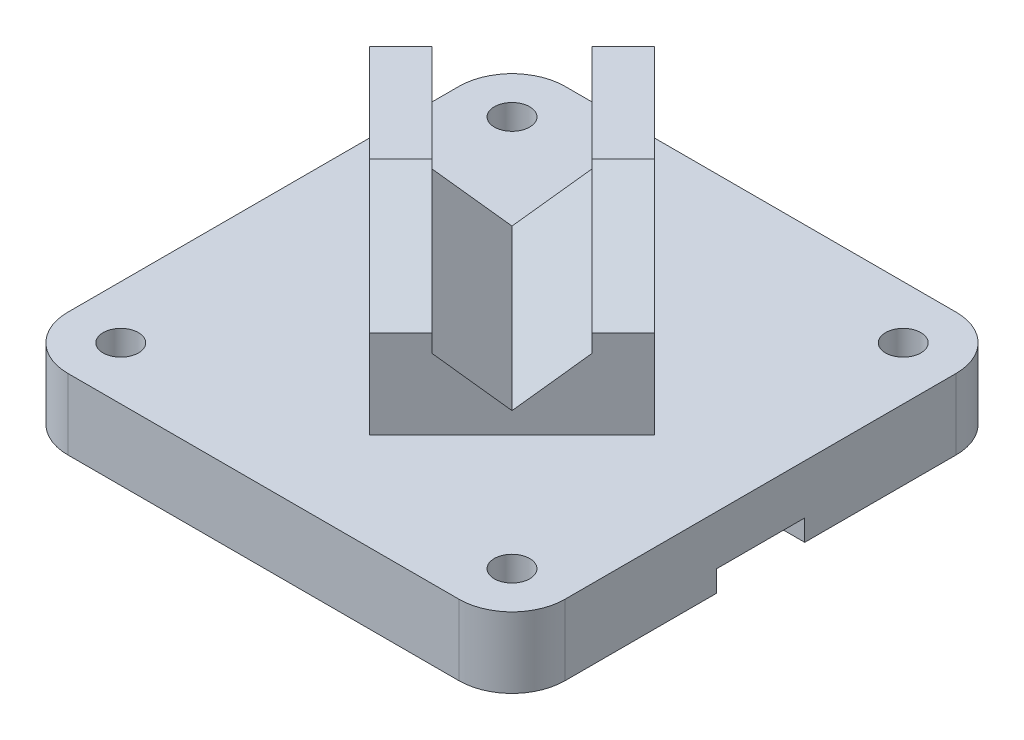
ISO-10303-21;
HEADER;
FILE_DESCRIPTION(('STEP AP214'),'2;1');
FILE_NAME('part.step','',(''),(''),'','','');
FILE_SCHEMA(('AUTOMOTIVE_DESIGN { 1 0 10303 214 1 1 1 1 }'));
ENDSEC;
DATA;
#1=APPLICATION_CONTEXT('core data for automotive mechanical design processes');
#2=APPLICATION_PROTOCOL_DEFINITION('international standard','automotive_design',2000,#1);
#3=PRODUCT_CONTEXT('',#1,'mechanical');
#4=PRODUCT('Part','Part','',(#3));
#5=PRODUCT_RELATED_PRODUCT_CATEGORY('part','',(#4));
#6=PRODUCT_DEFINITION_FORMATION('','',#4);
#7=PRODUCT_DEFINITION_CONTEXT('part definition',#1,'design');
#8=PRODUCT_DEFINITION('design','',#6,#7);
#9=PRODUCT_DEFINITION_SHAPE('','',#8);
#10=(LENGTH_UNIT() NAMED_UNIT(*) SI_UNIT(.MILLI.,.METRE.));
#11=(NAMED_UNIT(*) PLANE_ANGLE_UNIT() SI_UNIT($,.RADIAN.));
#12=(NAMED_UNIT(*) SI_UNIT($,.STERADIAN.) SOLID_ANGLE_UNIT());
#13=UNCERTAINTY_MEASURE_WITH_UNIT(LENGTH_MEASURE(1.E-05),#10,'distance_accuracy_value','');
#14=(GEOMETRIC_REPRESENTATION_CONTEXT(3) GLOBAL_UNCERTAINTY_ASSIGNED_CONTEXT((#13)) GLOBAL_UNIT_ASSIGNED_CONTEXT((#10,
#11,#12)) REPRESENTATION_CONTEXT('',''));
#15=CARTESIAN_POINT('',(0.,0.,0.));
#16=DIRECTION('',(0.,0.,1.));
#17=DIRECTION('',(1.,0.,0.));
#18=AXIS2_PLACEMENT_3D('',#15,#16,#17);
#19=CARTESIAN_POINT('',(0.,0.,0.));
#20=DIRECTION('',(0.,1.,0.));
#21=DIRECTION('',(0.,0.,1.));
#22=AXIS2_PLACEMENT_3D('',#19,#20,#21);
#23=PLANE('',#22);
#24=CARTESIAN_POINT('',(-55.3917579759353,0.,-55.3917579759351));
#25=DIRECTION('',(0.,1.,0.));
#26=DIRECTION('',(0.,0.,1.));
#27=AXIS2_PLACEMENT_3D('',#24,#25,#26);
#28=CIRCLE('',#27,5.00000000000001);
#29=CARTESIAN_POINT('',(-55.3917579759353,0.,-50.391757975935));
#30=VERTEX_POINT('',#29);
#31=EDGE_CURVE('E394',#30,#30,#28,.T.);
#32=ORIENTED_EDGE('',*,*,#31,.T.);
#33=EDGE_LOOP('',(#32));
#34=FACE_BOUND('',#33,.T.);
#35=CARTESIAN_POINT('',(55.3917579759351,0.,-55.3917579759352));
#36=DIRECTION('',(0.,1.,0.));
#37=DIRECTION('',(0.,0.,1.));
#38=AXIS2_PLACEMENT_3D('',#35,#36,#37);
#39=CIRCLE('',#38,4.99999999999999);
#40=CARTESIAN_POINT('',(55.3917579759351,0.,-50.3917579759352));
#41=VERTEX_POINT('',#40);
#42=EDGE_CURVE('E389',#41,#41,#39,.T.);
#43=ORIENTED_EDGE('',*,*,#42,.T.);
#44=EDGE_LOOP('',(#43));
#45=FACE_BOUND('',#44,.T.);
#46=DIRECTION('',(1.,0.,0.));
#47=VECTOR('',#46,1.);
#48=CARTESIAN_POINT('',(-70.3927579759352,0.,-12.5));
#49=LINE('',#48,#47);
#50=CARTESIAN_POINT('',(-70.3917579759351,0.,-12.5));
#51=VERTEX_POINT('',#50);
#52=CARTESIAN_POINT('',(70.3917579759351,0.,-12.5));
#53=VERTEX_POINT('',#52);
#54=EDGE_CURVE('E206',#51,#53,#49,.T.);
#55=ORIENTED_EDGE('',*,*,#54,.F.);
#56=DIRECTION('',(0.,0.,-1.));
#57=VECTOR('',#56,1.);
#58=CARTESIAN_POINT('',(-70.3917579759351,0.,0.));
#59=LINE('',#58,#57);
#60=CARTESIAN_POINT('',(-70.3917579759351,0.,-55.3917579759351));
#61=VERTEX_POINT('',#60);
#62=EDGE_CURVE('E225',#51,#61,#59,.T.);
#63=ORIENTED_EDGE('',*,*,#62,.T.);
#64=CARTESIAN_POINT('',(-55.3917579759353,0.,-55.3917579759351));
#65=DIRECTION('',(0.,1.,0.));
#66=DIRECTION('',(0.,0.,1.));
#67=AXIS2_PLACEMENT_3D('',#64,#65,#66);
#68=CIRCLE('',#67,14.9999999999999);
#69=CARTESIAN_POINT('',(-55.3917579759353,0.,-70.3917579759351));
#70=VERTEX_POINT('',#69);
#71=EDGE_CURVE('E229',#70,#61,#68,.T.);
#72=ORIENTED_EDGE('',*,*,#71,.F.);
#73=DIRECTION('',(1.,0.,0.));
#74=VECTOR('',#73,1.);
#75=CARTESIAN_POINT('',(0.,0.,-70.3917579759351));
#76=LINE('',#75,#74);
#77=CARTESIAN_POINT('',(55.3917579759351,0.,-70.3917579759351));
#78=VERTEX_POINT('',#77);
#79=EDGE_CURVE('E405',#70,#78,#76,.T.);
#80=ORIENTED_EDGE('',*,*,#79,.T.);
#81=CARTESIAN_POINT('',(55.3917579759351,0.,-55.3917579759352));
#82=DIRECTION('',(0.,1.,0.));
#83=DIRECTION('',(0.,0.,1.));
#84=AXIS2_PLACEMENT_3D('',#81,#82,#83);
#85=CIRCLE('',#84,15.);
#86=CARTESIAN_POINT('',(70.3917579759351,0.,-55.3917579759352));
#87=VERTEX_POINT('',#86);
#88=EDGE_CURVE('E399',#87,#78,#85,.T.);
#89=ORIENTED_EDGE('',*,*,#88,.F.);
#90=DIRECTION('',(0.,0.,-1.));
#91=VECTOR('',#90,1.);
#92=CARTESIAN_POINT('',(70.3917579759351,0.,0.));
#93=LINE('',#92,#91);
#94=EDGE_CURVE('E400',#53,#87,#93,.T.);
#95=ORIENTED_EDGE('',*,*,#94,.F.);
#96=EDGE_LOOP('',(#55,#63,#72,#80,#89,#95));
#97=FACE_BOUND('',#96,.T.);
#98=ADVANCED_FACE('F41',(#34,#45,#97),#23,.F.);
#99=CARTESIAN_POINT('',(55.3917579759351,0.,55.3917579759352));
#100=DIRECTION('',(0.,1.,0.));
#101=DIRECTION('',(0.,0.,1.));
#102=AXIS2_PLACEMENT_3D('',#99,#100,#101);
#103=CIRCLE('',#102,4.99999999999999);
#104=CARTESIAN_POINT('',(55.3917579759351,0.,60.3917579759352));
#105=VERTEX_POINT('',#104);
#106=EDGE_CURVE('E235',#105,#105,#103,.F.);
#107=ORIENTED_EDGE('',*,*,#106,.F.);
#108=EDGE_LOOP('',(#107));
#109=FACE_BOUND('',#108,.T.);
#110=CARTESIAN_POINT('',(-55.3917579759353,0.,55.3917579759351));
#111=DIRECTION('',(0.,1.,0.));
#112=DIRECTION('',(0.,0.,1.));
#113=AXIS2_PLACEMENT_3D('',#110,#111,#112);
#114=CIRCLE('',#113,5.00000000000001);
#115=CARTESIAN_POINT('',(-55.3917579759353,0.,60.3917579759351));
#116=VERTEX_POINT('',#115);
#117=EDGE_CURVE('E350',#116,#116,#114,.F.);
#118=ORIENTED_EDGE('',*,*,#117,.F.);
#119=EDGE_LOOP('',(#118));
#120=FACE_BOUND('',#119,.T.);
#121=DIRECTION('',(-1.,0.,0.));
#122=VECTOR('',#121,1.);
#123=CARTESIAN_POINT('',(-70.3927579759352,0.,12.5));
#124=LINE('',#123,#122);
#125=CARTESIAN_POINT('',(70.3917579759351,0.,12.5));
#126=VERTEX_POINT('',#125);
#127=CARTESIAN_POINT('',(-70.3917579759351,0.,12.5));
#128=VERTEX_POINT('',#127);
#129=EDGE_CURVE('E194',#126,#128,#124,.T.);
#130=ORIENTED_EDGE('',*,*,#129,.F.);
#131=CARTESIAN_POINT('',(70.3917579759351,0.,55.3917579759352));
#132=VERTEX_POINT('',#131);
#133=EDGE_CURVE('E397',#132,#126,#93,.T.);
#134=ORIENTED_EDGE('',*,*,#133,.F.);
#135=CARTESIAN_POINT('',(55.3917579759351,0.,55.3917579759352));
#136=DIRECTION('',(0.,1.,0.));
#137=DIRECTION('',(0.,0.,1.));
#138=AXIS2_PLACEMENT_3D('',#135,#136,#137);
#139=CIRCLE('',#138,15.);
#140=CARTESIAN_POINT('',(55.3917579759351,0.,70.3917579759351));
#141=VERTEX_POINT('',#140);
#142=EDGE_CURVE('E393',#132,#141,#139,.F.);
#143=ORIENTED_EDGE('',*,*,#142,.T.);
#144=DIRECTION('',(1.,0.,0.));
#145=VECTOR('',#144,1.);
#146=CARTESIAN_POINT('',(0.,0.,70.3917579759351));
#147=LINE('',#146,#145);
#148=CARTESIAN_POINT('',(-55.3917579759353,0.,70.3917579759351));
#149=VERTEX_POINT('',#148);
#150=EDGE_CURVE('E221',#149,#141,#147,.T.);
#151=ORIENTED_EDGE('',*,*,#150,.F.);
#152=CARTESIAN_POINT('',(-55.3917579759353,0.,55.3917579759351));
#153=DIRECTION('',(0.,1.,0.));
#154=DIRECTION('',(0.,0.,1.));
#155=AXIS2_PLACEMENT_3D('',#152,#153,#154);
#156=CIRCLE('',#155,14.9999999999999);
#157=CARTESIAN_POINT('',(-70.3917579759351,0.,55.3917579759351));
#158=VERTEX_POINT('',#157);
#159=EDGE_CURVE('E222',#149,#158,#156,.F.);
#160=ORIENTED_EDGE('',*,*,#159,.T.);
#161=EDGE_CURVE('E215',#158,#128,#59,.T.);
#162=ORIENTED_EDGE('',*,*,#161,.T.);
#163=EDGE_LOOP('',(#130,#134,#143,#151,#160,#162));
#164=FACE_BOUND('',#163,.T.);
#165=ADVANCED_FACE('F217',(#109,#120,#164),#23,.F.);
#166=CARTESIAN_POINT('',(70.3917579759351,20.,0.));
#167=DIRECTION('',(-1.,0.,0.));
#168=DIRECTION('',(0.,0.,1.));
#169=AXIS2_PLACEMENT_3D('',#166,#167,#168);
#170=PLANE('',#169);
#171=DIRECTION('',(0.,-1.,0.));
#172=VECTOR('',#171,1.);
#173=CARTESIAN_POINT('',(70.3917579759351,-6.,12.5));
#174=LINE('',#173,#172);
#175=CARTESIAN_POINT('',(70.3917579759351,6.,12.5));
#176=VERTEX_POINT('',#175);
#177=EDGE_CURVE('E203',#176,#126,#174,.T.);
#178=ORIENTED_EDGE('',*,*,#177,.F.);
#179=DIRECTION('',(0.,0.,1.));
#180=VECTOR('',#179,1.);
#181=CARTESIAN_POINT('',(70.3917579759351,6.,12.5));
#182=LINE('',#181,#180);
#183=CARTESIAN_POINT('',(70.3917579759351,6.,-12.5));
#184=VERTEX_POINT('',#183);
#185=EDGE_CURVE('E427',#184,#176,#182,.T.);
#186=ORIENTED_EDGE('',*,*,#185,.F.);
#187=DIRECTION('',(0.,1.,0.));
#188=VECTOR('',#187,1.);
#189=CARTESIAN_POINT('',(70.3917579759351,-6.,-12.5));
#190=LINE('',#189,#188);
#191=EDGE_CURVE('E428',#53,#184,#190,.T.);
#192=ORIENTED_EDGE('',*,*,#191,.F.);
#193=ORIENTED_EDGE('',*,*,#94,.T.);
#194=DIRECTION('',(0.,-1.,0.));
#195=VECTOR('',#194,1.);
#196=CARTESIAN_POINT('',(70.3917579759351,20.,-55.3917579759352));
#197=LINE('',#196,#195);
#198=CARTESIAN_POINT('',(70.3917579759351,20.,-55.3917579759352));
#199=VERTEX_POINT('',#198);
#200=EDGE_CURVE('E249',#199,#87,#197,.T.);
#201=ORIENTED_EDGE('',*,*,#200,.F.);
#202=DIRECTION('',(0.,0.,-1.));
#203=VECTOR('',#202,1.);
#204=CARTESIAN_POINT('',(70.3917579759351,20.,0.));
#205=LINE('',#204,#203);
#206=CARTESIAN_POINT('',(70.3917579759351,20.,55.3917579759352));
#207=VERTEX_POINT('',#206);
#208=EDGE_CURVE('E368',#207,#199,#205,.T.);
#209=ORIENTED_EDGE('',*,*,#208,.F.);
#210=DIRECTION('',(0.,-1.,0.));
#211=VECTOR('',#210,1.);
#212=CARTESIAN_POINT('',(70.3917579759351,20.,55.3917579759352));
#213=LINE('',#212,#211);
#214=EDGE_CURVE('E251',#207,#132,#213,.T.);
#215=ORIENTED_EDGE('',*,*,#214,.T.);
#216=ORIENTED_EDGE('',*,*,#133,.T.);
#217=EDGE_LOOP('',(#178,#186,#192,#193,#201,#209,#215,#216));
#218=FACE_BOUND('',#217,.T.);
#219=ADVANCED_FACE('F424',(#218),#170,.F.);
#220=CARTESIAN_POINT('',(-70.3917579759351,20.,0.));
#221=DIRECTION('',(-1.,0.,0.));
#222=DIRECTION('',(0.,0.,1.));
#223=AXIS2_PLACEMENT_3D('',#220,#221,#222);
#224=PLANE('',#223);
#225=ORIENTED_EDGE('',*,*,#62,.F.);
#226=DIRECTION('',(0.,1.,0.));
#227=VECTOR('',#226,1.);
#228=CARTESIAN_POINT('',(-70.3917579759351,-6.,-12.5));
#229=LINE('',#228,#227);
#230=CARTESIAN_POINT('',(-70.3917579759351,6.,-12.5));
#231=VERTEX_POINT('',#230);
#232=EDGE_CURVE('E216',#51,#231,#229,.T.);
#233=ORIENTED_EDGE('',*,*,#232,.T.);
#234=DIRECTION('',(0.,0.,1.));
#235=VECTOR('',#234,1.);
#236=CARTESIAN_POINT('',(-70.3917579759351,6.,12.5));
#237=LINE('',#236,#235);
#238=CARTESIAN_POINT('',(-70.3917579759351,6.,12.5));
#239=VERTEX_POINT('',#238);
#240=EDGE_CURVE('E214',#231,#239,#237,.T.);
#241=ORIENTED_EDGE('',*,*,#240,.T.);
#242=DIRECTION('',(0.,-1.,0.));
#243=VECTOR('',#242,1.);
#244=CARTESIAN_POINT('',(-70.3917579759351,-6.,12.5));
#245=LINE('',#244,#243);
#246=EDGE_CURVE('E196',#239,#128,#245,.T.);
#247=ORIENTED_EDGE('',*,*,#246,.T.);
#248=ORIENTED_EDGE('',*,*,#161,.F.);
#249=DIRECTION('',(0.,-1.,0.));
#250=VECTOR('',#249,1.);
#251=CARTESIAN_POINT('',(-70.3917579759351,20.,55.3917579759351));
#252=LINE('',#251,#250);
#253=CARTESIAN_POINT('',(-70.3917579759351,20.,55.3917579759351));
#254=VERTEX_POINT('',#253);
#255=EDGE_CURVE('E244',#254,#158,#252,.T.);
#256=ORIENTED_EDGE('',*,*,#255,.F.);
#257=DIRECTION('',(0.,0.,-1.));
#258=VECTOR('',#257,1.);
#259=CARTESIAN_POINT('',(-70.3917579759351,20.,0.));
#260=LINE('',#259,#258);
#261=CARTESIAN_POINT('',(-70.3917579759351,20.,-55.3917579759351));
#262=VERTEX_POINT('',#261);
#263=EDGE_CURVE('E376',#254,#262,#260,.T.);
#264=ORIENTED_EDGE('',*,*,#263,.T.);
#265=DIRECTION('',(0.,-1.,0.));
#266=VECTOR('',#265,1.);
#267=CARTESIAN_POINT('',(-70.3917579759351,20.,-55.3917579759351));
#268=LINE('',#267,#266);
#269=EDGE_CURVE('E245',#262,#61,#268,.T.);
#270=ORIENTED_EDGE('',*,*,#269,.T.);
#271=EDGE_LOOP('',(#225,#233,#241,#247,#248,#256,#264,#270));
#272=FACE_BOUND('',#271,.T.);
#273=ADVANCED_FACE('F211',(#272),#224,.T.);
#274=CARTESIAN_POINT('',(0.,70.,0.));
#275=DIRECTION('',(0.,1.,0.));
#276=DIRECTION('',(0.,0.,1.));
#277=AXIS2_PLACEMENT_3D('',#274,#275,#276);
#278=PLANE('',#277);
#279=DIRECTION('',(0.707106781186548,0.,0.707106781186547));
#280=VECTOR('',#279,1.);
#281=CARTESIAN_POINT('',(-59.0780494769504,70.,-81.7054664749199));
#282=LINE('',#281,#280);
#283=CARTESIAN_POINT('',(-11.3137084989848,70.,-33.9411254969543));
#284=VERTEX_POINT('',#283);
#285=CARTESIAN_POINT('',(16.2634559672906,70.,-6.36396103067892));
#286=VERTEX_POINT('',#285);
#287=EDGE_CURVE('E309',#284,#286,#282,.T.);
#288=ORIENTED_EDGE('',*,*,#287,.T.);
#289=DIRECTION('',(0.707106781186548,0.,-0.707106781186548));
#290=VECTOR('',#289,1.);
#291=CARTESIAN_POINT('',(25.1022907321225,70.,-15.2027957955107));
#292=LINE('',#291,#290);
#293=CARTESIAN_POINT('',(25.1022907321225,70.,-15.2027957955107));
#294=VERTEX_POINT('',#293);
#295=EDGE_CURVE('E282',#286,#294,#292,.T.);
#296=ORIENTED_EDGE('',*,*,#295,.T.);
#297=DIRECTION('',(-0.707106781186548,0.,-0.707106781186548));
#298=VECTOR('',#297,1.);
#299=CARTESIAN_POINT('',(20.1525432638166,70.,-20.1525432638166));
#300=LINE('',#299,#298);
#301=CARTESIAN_POINT('',(-2.47487373415294,70.,-42.7799602617861));
#302=VERTEX_POINT('',#301);
#303=EDGE_CURVE('E294',#294,#302,#300,.T.);
#304=ORIENTED_EDGE('',*,*,#303,.T.);
#305=DIRECTION('',(0.707106781186547,0.,-0.707106781186548));
#306=VECTOR('',#305,1.);
#307=CARTESIAN_POINT('',(-22.6274169979695,70.,-22.6274169979695));
#308=LINE('',#307,#306);
#309=EDGE_CURVE('E318',#284,#302,#308,.T.);
#310=ORIENTED_EDGE('',*,*,#309,.F.);
#311=EDGE_LOOP('',(#288,#296,#304,#310));
#312=FACE_BOUND('',#311,.T.);
#313=ADVANCED_FACE('F316',(#312),#278,.T.);
#314=CARTESIAN_POINT('',(-22.6274169979695,70.,-22.6274169979695));
#315=DIRECTION('',(-0.707106781186548,0.,-0.707106781186547));
#316=DIRECTION('',(-0.707106781186547,0.,0.707106781186548));
#317=AXIS2_PLACEMENT_3D('',#314,#315,#316);
#318=PLANE('',#317);
#319=CARTESIAN_POINT('',(-42.7799602617861,70.,-2.47487373415289));
#320=VERTEX_POINT('',#319);
#321=CARTESIAN_POINT('',(-33.9411254969543,70.,-11.3137084989847));
#322=VERTEX_POINT('',#321);
#323=EDGE_CURVE('E333',#320,#322,#308,.T.);
#324=ORIENTED_EDGE('',*,*,#323,.T.);
#325=DIRECTION('',(0.,-1.,0.));
#326=VECTOR('',#325,1.);
#327=CARTESIAN_POINT('',(-33.9411254969543,70.,-11.3137084989847));
#328=LINE('',#327,#326);
#329=CARTESIAN_POINT('',(-33.9411254969543,40.,-11.3137084989848));
#330=VERTEX_POINT('',#329);
#331=EDGE_CURVE('E257',#322,#330,#328,.T.);
#332=ORIENTED_EDGE('',*,*,#331,.T.);
#333=DIRECTION('',(0.532152084190191,-0.658504607868518,-0.532152084190192));
#334=VECTOR('',#333,1.);
#335=CARTESIAN_POINT('',(-38.0460993771169,45.0796460176991,-7.20873461882211));
#336=LINE('',#335,#334);
#337=CARTESIAN_POINT('',(-22.6274169979695,26.,-22.6274169979695));
#338=VERTEX_POINT('',#337);
#339=EDGE_CURVE('E254',#330,#338,#336,.T.);
#340=ORIENTED_EDGE('',*,*,#339,.T.);
#341=DIRECTION('',(0.532152084190191,0.658504607868518,-0.532152084190192));
#342=VECTOR('',#341,1.);
#343=CARTESIAN_POINT('',(-7.20873461882218,45.0796460176991,-38.0460993771169));
#344=LINE('',#343,#342);
#345=CARTESIAN_POINT('',(-11.3137084989848,40.,-33.9411254969543));
#346=VERTEX_POINT('',#345);
#347=EDGE_CURVE('E271',#338,#346,#344,.T.);
#348=ORIENTED_EDGE('',*,*,#347,.T.);
#349=DIRECTION('',(0.,1.,0.));
#350=VECTOR('',#349,1.);
#351=CARTESIAN_POINT('',(-11.3137084989848,70.,-33.9411254969543));
#352=LINE('',#351,#350);
#353=EDGE_CURVE('E262',#346,#284,#352,.T.);
#354=ORIENTED_EDGE('',*,*,#353,.T.);
#355=ORIENTED_EDGE('',*,*,#309,.T.);
#356=DIRECTION('',(0.,-1.,0.));
#357=VECTOR('',#356,1.);
#358=CARTESIAN_POINT('',(-2.47487373415294,70.,-42.7799602617861));
#359=LINE('',#358,#357);
#360=CARTESIAN_POINT('',(-2.47487373415294,20.,-42.7799602617861));
#361=VERTEX_POINT('',#360);
#362=EDGE_CURVE('E302',#302,#361,#359,.T.);
#363=ORIENTED_EDGE('',*,*,#362,.T.);
#364=DIRECTION('',(0.707106781186547,0.,-0.707106781186548));
#365=VECTOR('',#364,1.);
#366=CARTESIAN_POINT('',(-22.6274169979695,20.,-22.6274169979695));
#367=LINE('',#366,#365);
#368=CARTESIAN_POINT('',(-42.7799602617861,20.,-2.47487373415289));
#369=VERTEX_POINT('',#368);
#370=EDGE_CURVE('E352',#369,#361,#367,.T.);
#371=ORIENTED_EDGE('',*,*,#370,.F.);
#372=DIRECTION('',(0.,-1.,0.));
#373=VECTOR('',#372,1.);
#374=CARTESIAN_POINT('',(-42.7799602617861,70.,-2.47487373415289));
#375=LINE('',#374,#373);
#376=EDGE_CURVE('E343',#320,#369,#375,.T.);
#377=ORIENTED_EDGE('',*,*,#376,.F.);
#378=EDGE_LOOP('',(#324,#332,#340,#348,#354,#355,#363,#371,#377));
#379=FACE_BOUND('',#378,.T.);
#380=ADVANCED_FACE('F474',(#379),#318,.T.);
#381=CARTESIAN_POINT('',(-70.3917579759352,52.,70.3917579759352));
#382=DIRECTION('',(0.707106781186548,0.,-0.707106781186547));
#383=DIRECTION('',(-0.707106781186547,0.,-0.707106781186548));
#384=AXIS2_PLACEMENT_3D('',#381,#382,#383);
#385=CYLINDRICAL_SURFACE('',#384,8.00000000000001);
#386=CARTESIAN_POINT('',(-20.1525432638166,52.,20.1525432638166));
#387=DIRECTION('',(-0.707106781186548,0.,0.707106781186548));
#388=DIRECTION('',(0.707106781186548,0.,0.707106781186548));
#389=AXIS2_PLACEMENT_3D('',#386,#387,#388);
#390=CIRCLE('',#389,8.00000000000001);
#391=CARTESIAN_POINT('',(-14.4956890143242,52.,25.809397513309));
#392=VERTEX_POINT('',#391);
#393=EDGE_CURVE('E258',#392,#392,#390,.T.);
#394=ORIENTED_EDGE('',*,*,#393,.T.);
#395=EDGE_LOOP('',(#394));
#396=FACE_BOUND('',#395,.T.);
#397=CARTESIAN_POINT('',(-11.3137084989848,52.,11.3137084989848));
#398=DIRECTION('',(0.707106781186547,0.,-0.707106781186548));
#399=DIRECTION('',(-0.707106781186548,0.,-0.707106781186547));
#400=AXIS2_PLACEMENT_3D('',#397,#398,#399);
#401=CIRCLE('',#400,8.00000000000001);
#402=CARTESIAN_POINT('',(-16.9705627484771,52.,5.65685424949239));
#403=VERTEX_POINT('',#402);
#404=EDGE_CURVE('E266',#403,#403,#401,.F.);
#405=ORIENTED_EDGE('',*,*,#404,.F.);
#406=EDGE_LOOP('',(#405));
#407=FACE_BOUND('',#406,.T.);
#408=ADVANCED_FACE('F486',(#396,#407),#385,.F.);
#409=CARTESIAN_POINT('',(20.1525432638166,52.,-20.1525432638166));
#410=DIRECTION('',(-0.707106781186548,0.,0.707106781186548));
#411=DIRECTION('',(0.707106781186548,0.,0.707106781186548));
#412=AXIS2_PLACEMENT_3D('',#409,#410,#411);
#413=CIRCLE('',#412,8.00000000000001);
#414=CARTESIAN_POINT('',(25.809397513309,52.,-14.4956890143242));
#415=VERTEX_POINT('',#414);
#416=EDGE_CURVE('E259',#415,#415,#413,.T.);
#417=ORIENTED_EDGE('',*,*,#416,.F.);
#418=EDGE_LOOP('',(#417));
#419=FACE_BOUND('',#418,.T.);
#420=CARTESIAN_POINT('',(11.3137084989848,52.,-11.3137084989847));
#421=DIRECTION('',(-0.707106781186547,0.,0.707106781186548));
#422=DIRECTION('',(0.707106781186548,0.,0.707106781186547));
#423=AXIS2_PLACEMENT_3D('',#420,#421,#422);
#424=CIRCLE('',#423,8.00000000000001);
#425=CARTESIAN_POINT('',(16.9705627484772,52.,-5.65685424949236));
#426=VERTEX_POINT('',#425);
#427=EDGE_CURVE('E261',#426,#426,#424,.F.);
#428=ORIENTED_EDGE('',*,*,#427,.F.);
#429=EDGE_LOOP('',(#428));
#430=FACE_BOUND('',#429,.T.);
#431=ADVANCED_FACE('F488',(#419,#430),#385,.F.);
#432=CARTESIAN_POINT('',(55.3917579759351,20.,55.3917579759352));
#433=DIRECTION('',(0.,-1.,0.));
#434=DIRECTION('',(0.,0.,-1.));
#435=AXIS2_PLACEMENT_3D('',#432,#433,#434);
#436=CYLINDRICAL_SURFACE('',#435,15.);
#437=ORIENTED_EDGE('',*,*,#142,.F.);
#438=ORIENTED_EDGE('',*,*,#214,.F.);
#439=CARTESIAN_POINT('',(55.3917579759351,20.,55.3917579759352));
#440=DIRECTION('',(0.,1.,0.));
#441=DIRECTION('',(0.,0.,1.));
#442=AXIS2_PLACEMENT_3D('',#439,#440,#441);
#443=CIRCLE('',#442,15.);
#444=CARTESIAN_POINT('',(55.3917579759351,20.,70.3917579759351));
#445=VERTEX_POINT('',#444);
#446=EDGE_CURVE('E361',#207,#445,#443,.F.);
#447=ORIENTED_EDGE('',*,*,#446,.T.);
#448=DIRECTION('',(0.,-1.,0.));
#449=VECTOR('',#448,1.);
#450=CARTESIAN_POINT('',(55.3917579759351,20.,70.3917579759351));
#451=LINE('',#450,#449);
#452=EDGE_CURVE('E237',#445,#141,#451,.T.);
#453=ORIENTED_EDGE('',*,*,#452,.T.);
#454=EDGE_LOOP('',(#437,#438,#447,#453));
#455=FACE_BOUND('',#454,.T.);
#456=ADVANCED_FACE('F494',(#455),#436,.T.);
#457=CARTESIAN_POINT('',(55.3917579759351,20.,-55.3917579759352));
#458=DIRECTION('',(0.,-1.,0.));
#459=DIRECTION('',(0.,0.,-1.));
#460=AXIS2_PLACEMENT_3D('',#457,#458,#459);
#461=CYLINDRICAL_SURFACE('',#460,15.);
#462=ORIENTED_EDGE('',*,*,#88,.T.);
#463=DIRECTION('',(0.,-1.,0.));
#464=VECTOR('',#463,1.);
#465=CARTESIAN_POINT('',(55.3917579759351,20.,-70.3917579759351));
#466=LINE('',#465,#464);
#467=CARTESIAN_POINT('',(55.3917579759351,20.,-70.3917579759351));
#468=VERTEX_POINT('',#467);
#469=EDGE_CURVE('E247',#468,#78,#466,.T.);
#470=ORIENTED_EDGE('',*,*,#469,.F.);
#471=CARTESIAN_POINT('',(55.3917579759351,20.,-55.3917579759352));
#472=DIRECTION('',(0.,1.,0.));
#473=DIRECTION('',(0.,0.,1.));
#474=AXIS2_PLACEMENT_3D('',#471,#472,#473);
#475=CIRCLE('',#474,15.);
#476=EDGE_CURVE('E369',#199,#468,#475,.T.);
#477=ORIENTED_EDGE('',*,*,#476,.F.);
#478=ORIENTED_EDGE('',*,*,#200,.T.);
#479=EDGE_LOOP('',(#462,#470,#477,#478));
#480=FACE_BOUND('',#479,.T.);
#481=ADVANCED_FACE('F420',(#480),#461,.T.);
#482=CARTESIAN_POINT('',(0.,20.,-70.3917579759351));
#483=DIRECTION('',(0.,0.,-1.));
#484=DIRECTION('',(-1.,0.,0.));
#485=AXIS2_PLACEMENT_3D('',#482,#483,#484);
#486=PLANE('',#485);
#487=ORIENTED_EDGE('',*,*,#79,.F.);
#488=DIRECTION('',(0.,-1.,0.));
#489=VECTOR('',#488,1.);
#490=CARTESIAN_POINT('',(-55.3917579759353,20.,-70.3917579759351));
#491=LINE('',#490,#489);
#492=CARTESIAN_POINT('',(-55.3917579759353,20.,-70.3917579759351));
#493=VERTEX_POINT('',#492);
#494=EDGE_CURVE('E246',#493,#70,#491,.T.);
#495=ORIENTED_EDGE('',*,*,#494,.F.);
#496=DIRECTION('',(1.,0.,0.));
#497=VECTOR('',#496,1.);
#498=CARTESIAN_POINT('',(0.,20.,-70.3917579759351));
#499=LINE('',#498,#497);
#500=EDGE_CURVE('E371',#493,#468,#499,.T.);
#501=ORIENTED_EDGE('',*,*,#500,.T.);
#502=ORIENTED_EDGE('',*,*,#469,.T.);
#503=EDGE_LOOP('',(#487,#495,#501,#502));
#504=FACE_BOUND('',#503,.T.);
#505=ADVANCED_FACE('F414',(#504),#486,.T.);
#506=CARTESIAN_POINT('',(-55.3917579759353,20.,-55.3917579759351));
#507=DIRECTION('',(0.,-1.,0.));
#508=DIRECTION('',(0.,0.,-1.));
#509=AXIS2_PLACEMENT_3D('',#506,#507,#508);
#510=CYLINDRICAL_SURFACE('',#509,14.9999999999999);
#511=ORIENTED_EDGE('',*,*,#71,.T.);
#512=ORIENTED_EDGE('',*,*,#269,.F.);
#513=CARTESIAN_POINT('',(-55.3917579759353,20.,-55.3917579759351));
#514=DIRECTION('',(0.,1.,0.));
#515=DIRECTION('',(0.,0.,1.));
#516=AXIS2_PLACEMENT_3D('',#513,#514,#515);
#517=CIRCLE('',#516,14.9999999999999);
#518=EDGE_CURVE('E372',#493,#262,#517,.T.);
#519=ORIENTED_EDGE('',*,*,#518,.F.);
#520=ORIENTED_EDGE('',*,*,#494,.T.);
#521=EDGE_LOOP('',(#511,#512,#519,#520));
#522=FACE_BOUND('',#521,.T.);
#523=ADVANCED_FACE('F411',(#522),#510,.T.);
#524=CARTESIAN_POINT('',(-55.3917579759353,20.,55.3917579759351));
#525=DIRECTION('',(0.,-1.,0.));
#526=DIRECTION('',(0.,0.,-1.));
#527=AXIS2_PLACEMENT_3D('',#524,#525,#526);
#528=CYLINDRICAL_SURFACE('',#527,14.9999999999999);
#529=ORIENTED_EDGE('',*,*,#159,.F.);
#530=DIRECTION('',(0.,-1.,0.));
#531=VECTOR('',#530,1.);
#532=CARTESIAN_POINT('',(-55.3917579759353,20.,70.3917579759351));
#533=LINE('',#532,#531);
#534=CARTESIAN_POINT('',(-55.3917579759353,20.,70.3917579759351));
#535=VERTEX_POINT('',#534);
#536=EDGE_CURVE('E236',#535,#149,#533,.T.);
#537=ORIENTED_EDGE('',*,*,#536,.F.);
#538=CARTESIAN_POINT('',(-55.3917579759353,20.,55.3917579759351));
#539=DIRECTION('',(0.,1.,0.));
#540=DIRECTION('',(0.,0.,1.));
#541=AXIS2_PLACEMENT_3D('',#538,#539,#540);
#542=CIRCLE('',#541,14.9999999999999);
#543=EDGE_CURVE('E377',#535,#254,#542,.F.);
#544=ORIENTED_EDGE('',*,*,#543,.T.);
#545=ORIENTED_EDGE('',*,*,#255,.T.);
#546=EDGE_LOOP('',(#529,#537,#544,#545));
#547=FACE_BOUND('',#546,.T.);
#548=ADVANCED_FACE('F518',(#547),#528,.T.);
#549=CARTESIAN_POINT('',(0.,20.,70.3917579759351));
#550=DIRECTION('',(0.,0.,-1.));
#551=DIRECTION('',(-1.,0.,0.));
#552=AXIS2_PLACEMENT_3D('',#549,#550,#551);
#553=PLANE('',#552);
#554=ORIENTED_EDGE('',*,*,#150,.T.);
#555=ORIENTED_EDGE('',*,*,#452,.F.);
#556=DIRECTION('',(1.,0.,0.));
#557=VECTOR('',#556,1.);
#558=CARTESIAN_POINT('',(0.,20.,70.3917579759351));
#559=LINE('',#558,#557);
#560=EDGE_CURVE('E385',#535,#445,#559,.T.);
#561=ORIENTED_EDGE('',*,*,#560,.F.);
#562=ORIENTED_EDGE('',*,*,#536,.T.);
#563=EDGE_LOOP('',(#554,#555,#561,#562));
#564=FACE_BOUND('',#563,.T.);
#565=ADVANCED_FACE('F513',(#564),#553,.F.);
#566=CARTESIAN_POINT('',(-55.3917579759353,20.,-55.3917579759351));
#567=DIRECTION('',(0.,-1.,0.));
#568=DIRECTION('',(0.,0.,-1.));
#569=AXIS2_PLACEMENT_3D('',#566,#567,#568);
#570=CYLINDRICAL_SURFACE('',#569,5.00000000000001);
#571=CARTESIAN_POINT('',(-55.3917579759353,20.,-55.3917579759351));
#572=DIRECTION('',(0.,1.,0.));
#573=DIRECTION('',(0.,0.,1.));
#574=AXIS2_PLACEMENT_3D('',#571,#572,#573);
#575=CIRCLE('',#574,5.00000000000001);
#576=CARTESIAN_POINT('',(-55.3917579759353,20.,-50.391757975935));
#577=VERTEX_POINT('',#576);
#578=EDGE_CURVE('E359',#577,#577,#575,.T.);
#579=ORIENTED_EDGE('',*,*,#578,.T.);
#580=EDGE_LOOP('',(#579));
#581=FACE_BOUND('',#580,.T.);
#582=ORIENTED_EDGE('',*,*,#31,.F.);
#583=EDGE_LOOP('',(#582));
#584=FACE_BOUND('',#583,.T.);
#585=ADVANCED_FACE('F520',(#581,#584),#570,.F.);
#586=CARTESIAN_POINT('',(55.3917579759351,20.,-55.3917579759352));
#587=DIRECTION('',(0.,-1.,0.));
#588=DIRECTION('',(0.,0.,-1.));
#589=AXIS2_PLACEMENT_3D('',#586,#587,#588);
#590=CYLINDRICAL_SURFACE('',#589,4.99999999999999);
#591=CARTESIAN_POINT('',(55.3917579759351,20.,-55.3917579759352));
#592=DIRECTION('',(0.,1.,0.));
#593=DIRECTION('',(0.,0.,1.));
#594=AXIS2_PLACEMENT_3D('',#591,#592,#593);
#595=CIRCLE('',#594,4.99999999999999);
#596=CARTESIAN_POINT('',(55.3917579759351,20.,-50.3917579759352));
#597=VERTEX_POINT('',#596);
#598=EDGE_CURVE('E348',#597,#597,#595,.T.);
#599=ORIENTED_EDGE('',*,*,#598,.T.);
#600=EDGE_LOOP('',(#599));
#601=FACE_BOUND('',#600,.T.);
#602=ORIENTED_EDGE('',*,*,#42,.F.);
#603=EDGE_LOOP('',(#602));
#604=FACE_BOUND('',#603,.T.);
#605=ADVANCED_FACE('F537',(#601,#604),#590,.F.);
#606=CARTESIAN_POINT('',(-55.3917579759353,20.,55.3917579759351));
#607=DIRECTION('',(0.,-1.,0.));
#608=DIRECTION('',(0.,0.,-1.));
#609=AXIS2_PLACEMENT_3D('',#606,#607,#608);
#610=CYLINDRICAL_SURFACE('',#609,5.00000000000001);
#611=CARTESIAN_POINT('',(-55.3917579759353,20.,55.3917579759351));
#612=DIRECTION('',(0.,1.,0.));
#613=DIRECTION('',(0.,0.,1.));
#614=AXIS2_PLACEMENT_3D('',#611,#612,#613);
#615=CIRCLE('',#614,5.00000000000001);
#616=CARTESIAN_POINT('',(-55.3917579759353,20.,60.3917579759351));
#617=VERTEX_POINT('',#616);
#618=EDGE_CURVE('E234',#617,#617,#615,.F.);
#619=ORIENTED_EDGE('',*,*,#618,.F.);
#620=EDGE_LOOP('',(#619));
#621=FACE_BOUND('',#620,.T.);
#622=ORIENTED_EDGE('',*,*,#117,.T.);
#623=EDGE_LOOP('',(#622));
#624=FACE_BOUND('',#623,.T.);
#625=ADVANCED_FACE('F511',(#621,#624),#610,.F.);
#626=CARTESIAN_POINT('',(55.3917579759351,20.,55.3917579759352));
#627=DIRECTION('',(0.,-1.,0.));
#628=DIRECTION('',(0.,0.,-1.));
#629=AXIS2_PLACEMENT_3D('',#626,#627,#628);
#630=CYLINDRICAL_SURFACE('',#629,4.99999999999999);
#631=CARTESIAN_POINT('',(55.3917579759351,20.,55.3917579759352));
#632=DIRECTION('',(0.,1.,0.));
#633=DIRECTION('',(0.,0.,1.));
#634=AXIS2_PLACEMENT_3D('',#631,#632,#633);
#635=CIRCLE('',#634,4.99999999999999);
#636=CARTESIAN_POINT('',(55.3917579759351,20.,60.3917579759352));
#637=VERTEX_POINT('',#636);
#638=EDGE_CURVE('E239',#637,#637,#635,.F.);
#639=ORIENTED_EDGE('',*,*,#638,.F.);
#640=EDGE_LOOP('',(#639));
#641=FACE_BOUND('',#640,.T.);
#642=ORIENTED_EDGE('',*,*,#106,.T.);
#643=EDGE_LOOP('',(#642));
#644=FACE_BOUND('',#643,.T.);
#645=ADVANCED_FACE('F509',(#641,#644),#630,.F.);
#646=CARTESIAN_POINT('',(0.,20.,0.));
#647=DIRECTION('',(0.,1.,0.));
#648=DIRECTION('',(0.,0.,1.));
#649=AXIS2_PLACEMENT_3D('',#646,#647,#648);
#650=PLANE('',#649);
#651=ORIENTED_EDGE('',*,*,#618,.T.);
#652=EDGE_LOOP('',(#651));
#653=FACE_BOUND('',#652,.T.);
#654=ORIENTED_EDGE('',*,*,#598,.F.);
#655=EDGE_LOOP('',(#654));
#656=FACE_BOUND('',#655,.T.);
#657=DIRECTION('',(-0.707106781186548,0.,-0.707106781186548));
#658=VECTOR('',#657,1.);
#659=CARTESIAN_POINT('',(-20.1525432638166,20.,20.1525432638166));
#660=LINE('',#659,#658);
#661=CARTESIAN_POINT('',(2.47487373415294,20.,42.7799602617861));
#662=VERTEX_POINT('',#661);
#663=EDGE_CURVE('E355',#662,#369,#660,.T.);
#664=ORIENTED_EDGE('',*,*,#663,.T.);
#665=ORIENTED_EDGE('',*,*,#370,.T.);
#666=DIRECTION('',(-0.707106781186548,0.,-0.707106781186548));
#667=VECTOR('',#666,1.);
#668=CARTESIAN_POINT('',(20.1525432638166,20.,-20.1525432638166));
#669=LINE('',#668,#667);
#670=CARTESIAN_POINT('',(42.7799602617861,20.,2.47487373415294));
#671=VERTEX_POINT('',#670);
#672=EDGE_CURVE('E360',#671,#361,#669,.T.);
#673=ORIENTED_EDGE('',*,*,#672,.F.);
#674=DIRECTION('',(0.707106781186548,0.,-0.707106781186548));
#675=VECTOR('',#674,1.);
#676=CARTESIAN_POINT('',(22.6274169979695,20.,22.6274169979695));
#677=LINE('',#676,#675);
#678=EDGE_CURVE('E301',#662,#671,#677,.T.);
#679=ORIENTED_EDGE('',*,*,#678,.F.);
#680=EDGE_LOOP('',(#664,#665,#673,#679));
#681=FACE_BOUND('',#680,.T.);
#682=ORIENTED_EDGE('',*,*,#578,.F.);
#683=EDGE_LOOP('',(#682));
#684=FACE_BOUND('',#683,.T.);
#685=ORIENTED_EDGE('',*,*,#446,.F.);
#686=ORIENTED_EDGE('',*,*,#208,.T.);
#687=ORIENTED_EDGE('',*,*,#476,.T.);
#688=ORIENTED_EDGE('',*,*,#500,.F.);
#689=ORIENTED_EDGE('',*,*,#518,.T.);
#690=ORIENTED_EDGE('',*,*,#263,.F.);
#691=ORIENTED_EDGE('',*,*,#543,.F.);
#692=ORIENTED_EDGE('',*,*,#560,.T.);
#693=EDGE_LOOP('',(#685,#686,#687,#688,#689,#690,#691,#692));
#694=FACE_BOUND('',#693,.T.);
#695=ORIENTED_EDGE('',*,*,#638,.T.);
#696=EDGE_LOOP('',(#695));
#697=FACE_BOUND('',#696,.T.);
#698=ADVANCED_FACE('F476',(#653,#656,#681,#684,#694,#697),#650,.T.);
#699=DIRECTION('',(-0.707106781186548,0.,-0.707106781186548));
#700=VECTOR('',#699,1.);
#701=CARTESIAN_POINT('',(-20.1525432638166,70.,20.1525432638166));
#702=LINE('',#701,#700);
#703=CARTESIAN_POINT('',(-15.2027957955108,70.,25.1022907321224));
#704=VERTEX_POINT('',#703);
#705=EDGE_CURVE('E340',#704,#320,#702,.T.);
#706=ORIENTED_EDGE('',*,*,#705,.F.);
#707=DIRECTION('',(0.707106781186548,0.,-0.707106781186548));
#708=VECTOR('',#707,1.);
#709=CARTESIAN_POINT('',(-6.36396103067892,70.,16.2634559672906));
#710=LINE('',#709,#708);
#711=CARTESIAN_POINT('',(-6.36396103067893,70.,16.2634559672906));
#712=VERTEX_POINT('',#711);
#713=EDGE_CURVE('E273',#704,#712,#710,.T.);
#714=ORIENTED_EDGE('',*,*,#713,.T.);
#715=DIRECTION('',(0.707106781186548,0.,0.707106781186547));
#716=VECTOR('',#715,1.);
#717=CARTESIAN_POINT('',(-81.70546647492,70.,-59.0780494769504));
#718=LINE('',#717,#716);
#719=EDGE_CURVE('E264',#322,#712,#718,.T.);
#720=ORIENTED_EDGE('',*,*,#719,.F.);
#721=ORIENTED_EDGE('',*,*,#323,.F.);
#722=EDGE_LOOP('',(#706,#714,#720,#721));
#723=FACE_BOUND('',#722,.T.);
#724=ADVANCED_FACE('F472',(#723),#278,.T.);
#725=CARTESIAN_POINT('',(20.1525432638166,70.,-20.1525432638166));
#726=DIRECTION('',(-0.707106781186548,0.,0.707106781186548));
#727=DIRECTION('',(0.707106781186548,0.,0.707106781186548));
#728=AXIS2_PLACEMENT_3D('',#725,#726,#727);
#729=PLANE('',#728);
#730=ORIENTED_EDGE('',*,*,#416,.T.);
#731=EDGE_LOOP('',(#730));
#732=FACE_BOUND('',#731,.T.);
#733=ORIENTED_EDGE('',*,*,#303,.F.);
#734=DIRECTION('',(0.499999999999999,-0.707106781186549,0.499999999999999));
#735=VECTOR('',#734,1.);
#736=CARTESIAN_POINT('',(25.1022907321225,70.,-15.2027957955107));
#737=LINE('',#736,#735);
#738=CARTESIAN_POINT('',(42.7799602617861,44.9999999999999,2.47487373415294));
#739=VERTEX_POINT('',#738);
#740=EDGE_CURVE('E49',#294,#739,#737,.T.);
#741=ORIENTED_EDGE('',*,*,#740,.T.);
#742=DIRECTION('',(0.,-1.,0.));
#743=VECTOR('',#742,1.);
#744=CARTESIAN_POINT('',(42.7799602617861,70.,2.47487373415294));
#745=LINE('',#744,#743);
#746=EDGE_CURVE('E292',#739,#671,#745,.T.);
#747=ORIENTED_EDGE('',*,*,#746,.T.);
#748=ORIENTED_EDGE('',*,*,#672,.T.);
#749=ORIENTED_EDGE('',*,*,#362,.F.);
#750=EDGE_LOOP('',(#733,#741,#747,#748,#749));
#751=FACE_BOUND('',#750,.T.);
#752=ADVANCED_FACE('F288',(#732,#751),#729,.F.);
#753=CARTESIAN_POINT('',(22.6274169979695,70.,22.6274169979695));
#754=DIRECTION('',(-0.707106781186548,0.,-0.707106781186548));
#755=DIRECTION('',(-0.707106781186548,0.,0.707106781186548));
#756=AXIS2_PLACEMENT_3D('',#753,#754,#755);
#757=PLANE('',#756);
#758=DIRECTION('',(0.,1.,0.));
#759=VECTOR('',#758,1.);
#760=CARTESIAN_POINT('',(11.3137084989848,0.,33.9411254969543));
#761=LINE('',#760,#759);
#762=CARTESIAN_POINT('',(11.3137084989848,40.,33.9411254969543));
#763=VERTEX_POINT('',#762);
#764=CARTESIAN_POINT('',(11.3137084989848,44.9999999999999,33.9411254969543));
#765=VERTEX_POINT('',#764);
#766=EDGE_CURVE('E442',#763,#765,#761,.T.);
#767=ORIENTED_EDGE('',*,*,#766,.T.);
#768=DIRECTION('',(-0.707106781186548,0.,0.707106781186548));
#769=VECTOR('',#768,1.);
#770=CARTESIAN_POINT('',(2.47487373415294,44.9999999999999,42.7799602617861));
#771=LINE('',#770,#769);
#772=CARTESIAN_POINT('',(2.47487373415294,44.9999999999999,42.7799602617861));
#773=VERTEX_POINT('',#772);
#774=EDGE_CURVE('E284',#765,#773,#771,.T.);
#775=ORIENTED_EDGE('',*,*,#774,.T.);
#776=DIRECTION('',(0.,-1.,0.));
#777=VECTOR('',#776,1.);
#778=CARTESIAN_POINT('',(2.47487373415294,70.,42.7799602617861));
#779=LINE('',#778,#777);
#780=EDGE_CURVE('E305',#773,#662,#779,.T.);
#781=ORIENTED_EDGE('',*,*,#780,.T.);
#782=ORIENTED_EDGE('',*,*,#678,.T.);
#783=ORIENTED_EDGE('',*,*,#746,.F.);
#784=DIRECTION('',(-0.707106781186548,0.,0.707106781186548));
#785=VECTOR('',#784,1.);
#786=CARTESIAN_POINT('',(33.9411254969543,44.9999999999999,11.3137084989848));
#787=LINE('',#786,#785);
#788=CARTESIAN_POINT('',(33.9411254969543,44.9999999999999,11.3137084989848));
#789=VERTEX_POINT('',#788);
#790=EDGE_CURVE('E276',#739,#789,#787,.T.);
#791=ORIENTED_EDGE('',*,*,#790,.T.);
#792=DIRECTION('',(0.,-1.,0.));
#793=VECTOR('',#792,1.);
#794=CARTESIAN_POINT('',(33.9411254969543,0.,11.3137084989848));
#795=LINE('',#794,#793);
#796=CARTESIAN_POINT('',(33.9411254969543,40.,11.3137084989848));
#797=VERTEX_POINT('',#796);
#798=EDGE_CURVE('E311',#789,#797,#795,.T.);
#799=ORIENTED_EDGE('',*,*,#798,.T.);
#800=DIRECTION('',(-0.532152084190191,-0.658504607868518,0.532152084190191));
#801=VECTOR('',#800,1.);
#802=CARTESIAN_POINT('',(13.5163774102916,14.7256637168142,31.7384565856475));
#803=LINE('',#802,#801);
#804=CARTESIAN_POINT('',(22.6274169979695,26.,22.6274169979695));
#805=VERTEX_POINT('',#804);
#806=EDGE_CURVE('E449',#797,#805,#803,.T.);
#807=ORIENTED_EDGE('',*,*,#806,.T.);
#808=DIRECTION('',(-0.532152084190191,0.658504607868518,0.532152084190192));
#809=VECTOR('',#808,1.);
#810=CARTESIAN_POINT('',(31.7384565856475,14.7256637168142,13.5163774102915));
#811=LINE('',#810,#809);
#812=EDGE_CURVE('E444',#805,#763,#811,.T.);
#813=ORIENTED_EDGE('',*,*,#812,.T.);
#814=EDGE_LOOP('',(#767,#775,#781,#782,#783,#791,#799,#807,#813));
#815=FACE_BOUND('',#814,.T.);
#816=ADVANCED_FACE('F300',(#815),#757,.F.);
#817=CARTESIAN_POINT('',(-20.1525432638166,70.,20.1525432638166));
#818=DIRECTION('',(-0.707106781186548,0.,0.707106781186548));
#819=DIRECTION('',(0.707106781186548,0.,0.707106781186548));
#820=AXIS2_PLACEMENT_3D('',#817,#818,#819);
#821=PLANE('',#820);
#822=ORIENTED_EDGE('',*,*,#393,.F.);
#823=EDGE_LOOP('',(#822));
#824=FACE_BOUND('',#823,.T.);
#825=ORIENTED_EDGE('',*,*,#780,.F.);
#826=DIRECTION('',(-0.499999999999999,0.707106781186548,-0.499999999999999));
#827=VECTOR('',#826,1.);
#828=CARTESIAN_POINT('',(-17.6776695296637,73.5,22.6274169979695));
#829=LINE('',#828,#827);
#830=EDGE_CURVE('E285',#773,#704,#829,.T.);
#831=ORIENTED_EDGE('',*,*,#830,.T.);
#832=ORIENTED_EDGE('',*,*,#705,.T.);
#833=ORIENTED_EDGE('',*,*,#376,.T.);
#834=ORIENTED_EDGE('',*,*,#663,.F.);
#835=EDGE_LOOP('',(#825,#831,#832,#833,#834));
#836=FACE_BOUND('',#835,.T.);
#837=ADVANCED_FACE('F470',(#824,#836),#821,.T.);
#838=CARTESIAN_POINT('',(-81.70546647492,0.,-59.0780494769504));
#839=DIRECTION('',(0.707106781186547,0.,-0.707106781186548));
#840=DIRECTION('',(-0.707106781186548,0.,-0.707106781186547));
#841=AXIS2_PLACEMENT_3D('',#838,#839,#840);
#842=PLANE('',#841);
#843=ORIENTED_EDGE('',*,*,#719,.T.);
#844=DIRECTION('',(0.5,-0.707106781186548,0.499999999999999));
#845=VECTOR('',#844,1.);
#846=CARTESIAN_POINT('',(-19.2859764112702,88.2744894044259,3.34144058669934));
#847=LINE('',#846,#845);
#848=EDGE_CURVE('E280',#712,#765,#847,.T.);
#849=ORIENTED_EDGE('',*,*,#848,.T.);
#850=ORIENTED_EDGE('',*,*,#766,.F.);
#851=DIRECTION('',(0.707106781186548,0.,0.707106781186547));
#852=VECTOR('',#851,1.);
#853=CARTESIAN_POINT('',(-81.7054664749199,40.,-59.0780494769504));
#854=LINE('',#853,#852);
#855=EDGE_CURVE('E327',#330,#763,#854,.T.);
#856=ORIENTED_EDGE('',*,*,#855,.F.);
#857=ORIENTED_EDGE('',*,*,#331,.F.);
#858=EDGE_LOOP('',(#843,#849,#850,#856,#857));
#859=FACE_BOUND('',#858,.T.);
#860=ORIENTED_EDGE('',*,*,#404,.T.);
#861=EDGE_LOOP('',(#860));
#862=FACE_BOUND('',#861,.T.);
#863=ADVANCED_FACE('F477',(#859,#862),#842,.T.);
#864=CARTESIAN_POINT('',(-59.0780494769504,0.,-81.7054664749199));
#865=DIRECTION('',(-0.707106781186547,0.,0.707106781186548));
#866=DIRECTION('',(0.707106781186548,0.,0.707106781186547));
#867=AXIS2_PLACEMENT_3D('',#864,#865,#866);
#868=PLANE('',#867);
#869=ORIENTED_EDGE('',*,*,#798,.F.);
#870=DIRECTION('',(-0.5,0.707106781186549,-0.499999999999999));
#871=VECTOR('',#870,1.);
#872=CARTESIAN_POINT('',(3.34144058669936,88.2744894044259,-19.2859764112702));
#873=LINE('',#872,#871);
#874=EDGE_CURVE('E11',#789,#286,#873,.T.);
#875=ORIENTED_EDGE('',*,*,#874,.T.);
#876=ORIENTED_EDGE('',*,*,#287,.F.);
#877=ORIENTED_EDGE('',*,*,#353,.F.);
#878=DIRECTION('',(0.707106781186548,0.,0.707106781186547));
#879=VECTOR('',#878,1.);
#880=CARTESIAN_POINT('',(-59.0780494769504,40.,-81.7054664749199));
#881=LINE('',#880,#879);
#882=EDGE_CURVE('E317',#346,#797,#881,.T.);
#883=ORIENTED_EDGE('',*,*,#882,.T.);
#884=EDGE_LOOP('',(#869,#875,#876,#877,#883));
#885=FACE_BOUND('',#884,.T.);
#886=ORIENTED_EDGE('',*,*,#427,.T.);
#887=EDGE_LOOP('',(#886));
#888=FACE_BOUND('',#887,.T.);
#889=ADVANCED_FACE('F306',(#885,#888),#868,.T.);
#890=CARTESIAN_POINT('',(-79.5027975636132,14.7256637168142,-61.2807183882572));
#891=DIRECTION('',(-0.465633073666418,0.752576694706877,0.465633073666418));
#892=DIRECTION('',(0.,-0.526152219601981,0.850390405524374));
#893=AXIS2_PLACEMENT_3D('',#890,#891,#892);
#894=PLANE('',#893);
#895=DIRECTION('',(0.707106781186548,0.,0.707106781186547));
#896=VECTOR('',#895,1.);
#897=CARTESIAN_POINT('',(-70.3917579759352,26.,-70.3917579759352));
#898=LINE('',#897,#896);
#899=EDGE_CURVE('E323',#338,#805,#898,.T.);
#900=ORIENTED_EDGE('',*,*,#899,.T.);
#901=ORIENTED_EDGE('',*,*,#806,.F.);
#902=ORIENTED_EDGE('',*,*,#882,.F.);
#903=ORIENTED_EDGE('',*,*,#347,.F.);
#904=EDGE_LOOP('',(#900,#901,#902,#903));
#905=FACE_BOUND('',#904,.T.);
#906=ADVANCED_FACE('F455',(#905),#894,.T.);
#907=CARTESIAN_POINT('',(-61.2807183882572,14.7256637168142,-79.5027975636132));
#908=DIRECTION('',(0.465633073666417,0.752576694706878,-0.465633073666418));
#909=DIRECTION('',(0.,0.52615221960198,0.850390405524374));
#910=AXIS2_PLACEMENT_3D('',#907,#908,#909);
#911=PLANE('',#910);
#912=ORIENTED_EDGE('',*,*,#855,.T.);
#913=ORIENTED_EDGE('',*,*,#812,.F.);
#914=ORIENTED_EDGE('',*,*,#899,.F.);
#915=ORIENTED_EDGE('',*,*,#339,.F.);
#916=EDGE_LOOP('',(#912,#913,#914,#915));
#917=FACE_BOUND('',#916,.T.);
#918=ADVANCED_FACE('F454',(#917),#911,.T.);
#919=CARTESIAN_POINT('',(4.94974746830584,70.,4.94974746830584));
#920=DIRECTION('',(0.500000000000001,0.707106781186547,0.500000000000001));
#921=DIRECTION('',(-0.707106781186548,0.,0.707106781186548));
#922=AXIS2_PLACEMENT_3D('',#919,#920,#921);
#923=PLANE('',#922);
#924=ORIENTED_EDGE('',*,*,#830,.F.);
#925=ORIENTED_EDGE('',*,*,#774,.F.);
#926=ORIENTED_EDGE('',*,*,#848,.F.);
#927=ORIENTED_EDGE('',*,*,#713,.F.);
#928=EDGE_LOOP('',(#924,#925,#926,#927));
#929=FACE_BOUND('',#928,.T.);
#930=ADVANCED_FACE('F465',(#929),#923,.T.);
#931=CARTESIAN_POINT('',(4.94974746830585,70.,4.94974746830585));
#932=DIRECTION('',(0.500000000000001,0.707106781186546,0.500000000000001));
#933=DIRECTION('',(-0.707106781186548,0.,0.707106781186548));
#934=AXIS2_PLACEMENT_3D('',#931,#932,#933);
#935=PLANE('',#934);
#936=ORIENTED_EDGE('',*,*,#874,.F.);
#937=ORIENTED_EDGE('',*,*,#790,.F.);
#938=ORIENTED_EDGE('',*,*,#740,.F.);
#939=ORIENTED_EDGE('',*,*,#295,.F.);
#940=EDGE_LOOP('',(#936,#937,#938,#939));
#941=FACE_BOUND('',#940,.T.);
#942=ADVANCED_FACE('F42',(#941),#935,.T.);
#943=CARTESIAN_POINT('',(-70.3927579759352,-6.,-12.5));
#944=DIRECTION('',(0.,0.,-1.));
#945=DIRECTION('',(-1.,0.,0.));
#946=AXIS2_PLACEMENT_3D('',#943,#944,#945);
#947=PLANE('',#946);
#948=ORIENTED_EDGE('',*,*,#54,.T.);
#949=ORIENTED_EDGE('',*,*,#191,.T.);
#950=DIRECTION('',(1.,0.,0.));
#951=VECTOR('',#950,1.);
#952=CARTESIAN_POINT('',(-70.3927579759352,6.,-12.5));
#953=LINE('',#952,#951);
#954=EDGE_CURVE('E440',#231,#184,#953,.T.);
#955=ORIENTED_EDGE('',*,*,#954,.F.);
#956=ORIENTED_EDGE('',*,*,#232,.F.);
#957=EDGE_LOOP('',(#948,#949,#955,#956));
#958=FACE_BOUND('',#957,.T.);
#959=ADVANCED_FACE('F554',(#958),#947,.F.);
#960=CARTESIAN_POINT('',(-70.3927579759352,-6.,12.5));
#961=DIRECTION('',(0.,0.,1.));
#962=DIRECTION('',(1.,0.,0.));
#963=AXIS2_PLACEMENT_3D('',#960,#961,#962);
#964=PLANE('',#963);
#965=DIRECTION('',(1.,0.,0.));
#966=VECTOR('',#965,1.);
#967=CARTESIAN_POINT('',(-70.3927579759352,6.,12.5));
#968=LINE('',#967,#966);
#969=EDGE_CURVE('E60',#239,#176,#968,.T.);
#970=ORIENTED_EDGE('',*,*,#969,.T.);
#971=ORIENTED_EDGE('',*,*,#177,.T.);
#972=ORIENTED_EDGE('',*,*,#129,.T.);
#973=ORIENTED_EDGE('',*,*,#246,.F.);
#974=EDGE_LOOP('',(#970,#971,#972,#973));
#975=FACE_BOUND('',#974,.T.);
#976=ADVANCED_FACE('F197',(#975),#964,.F.);
#977=CARTESIAN_POINT('',(-70.3927579759352,6.,12.5));
#978=DIRECTION('',(0.,1.,0.));
#979=DIRECTION('',(0.,0.,1.));
#980=AXIS2_PLACEMENT_3D('',#977,#978,#979);
#981=PLANE('',#980);
#982=ORIENTED_EDGE('',*,*,#954,.T.);
#983=ORIENTED_EDGE('',*,*,#185,.T.);
#984=ORIENTED_EDGE('',*,*,#969,.F.);
#985=ORIENTED_EDGE('',*,*,#240,.F.);
#986=EDGE_LOOP('',(#982,#983,#984,#985));
#987=FACE_BOUND('',#986,.T.);
#988=ADVANCED_FACE('F564',(#987),#981,.F.);
#989=CLOSED_SHELL('',(#98,#165,#219,#273,#313,#380,#408,#431,#456,#481,#505,#523,#548,#565,#585,
#605,#625,#645,#698,#724,#752,#816,#837,#863,#889,#906,#918,#930,#942,#959,#976,#988));
#990=MANIFOLD_SOLID_BREP('B2',#989);
#991=ADVANCED_BREP_SHAPE_REPRESENTATION('',(#18,#990),#14);
#992=SHAPE_DEFINITION_REPRESENTATION(#9,#991);
ENDSEC;
END-ISO-10303-21;
